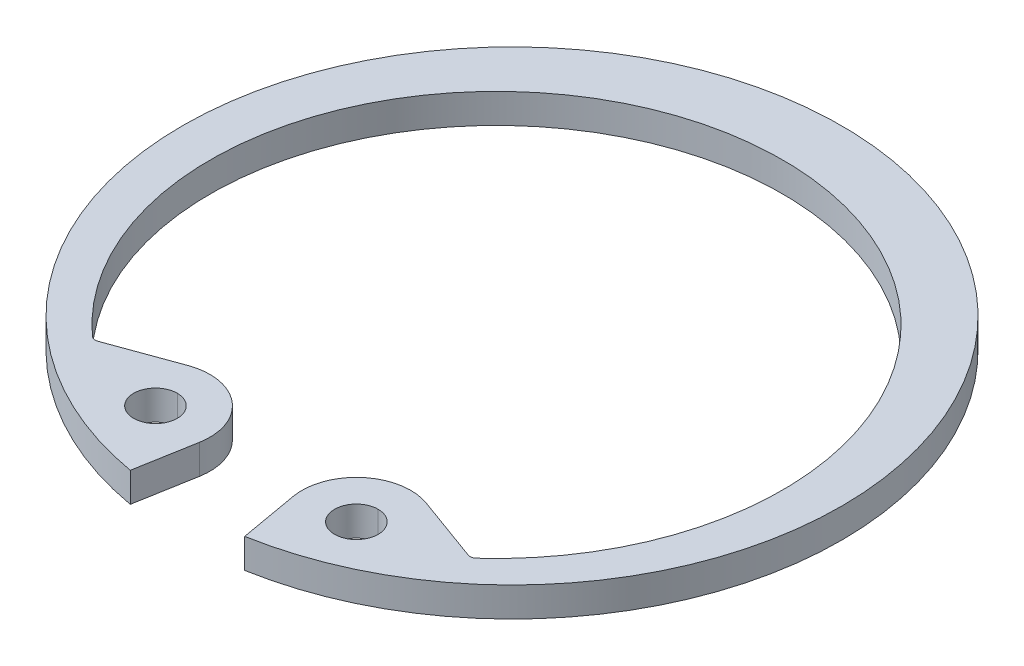
ISO-10303-21;
HEADER;
FILE_DESCRIPTION(('STEP AP214'),'2;1');
FILE_NAME('part.step','',(''),(''),'','','');
FILE_SCHEMA(('AUTOMOTIVE_DESIGN { 1 0 10303 214 1 1 1 1 }'));
ENDSEC;
DATA;
#1=APPLICATION_CONTEXT('core data for automotive mechanical design processes');
#2=APPLICATION_PROTOCOL_DEFINITION('international standard','automotive_design',2000,#1);
#3=PRODUCT_CONTEXT('',#1,'mechanical');
#4=PRODUCT('Part','Part','',(#3));
#5=PRODUCT_RELATED_PRODUCT_CATEGORY('part','',(#4));
#6=PRODUCT_DEFINITION_FORMATION('','',#4);
#7=PRODUCT_DEFINITION_CONTEXT('part definition',#1,'design');
#8=PRODUCT_DEFINITION('design','',#6,#7);
#9=PRODUCT_DEFINITION_SHAPE('','',#8);
#10=(LENGTH_UNIT() NAMED_UNIT(*) SI_UNIT(.MILLI.,.METRE.));
#11=(NAMED_UNIT(*) PLANE_ANGLE_UNIT() SI_UNIT($,.RADIAN.));
#12=(NAMED_UNIT(*) SI_UNIT($,.STERADIAN.) SOLID_ANGLE_UNIT());
#13=UNCERTAINTY_MEASURE_WITH_UNIT(LENGTH_MEASURE(1.E-05),#10,'distance_accuracy_value','');
#14=(GEOMETRIC_REPRESENTATION_CONTEXT(3) GLOBAL_UNCERTAINTY_ASSIGNED_CONTEXT((#13)) GLOBAL_UNIT_ASSIGNED_CONTEXT((#10,
#11,#12)) REPRESENTATION_CONTEXT('',''));
#15=CARTESIAN_POINT('',(0.,0.,0.));
#16=DIRECTION('',(0.,0.,1.));
#17=DIRECTION('',(1.,0.,0.));
#18=AXIS2_PLACEMENT_3D('',#15,#16,#17);
#19=CARTESIAN_POINT('',(6.77409763910835,-1.0668,8.03619111744191));
#20=DIRECTION('',(0.,1.,0.));
#21=DIRECTION('',(0.,0.,1.));
#22=AXIS2_PLACEMENT_3D('',#19,#20,#21);
#23=CYLINDRICAL_SURFACE('',#22,0.254);
#24=DIRECTION('',(0.,1.,0.));
#25=VECTOR('',#24,1.);
#26=CARTESIAN_POINT('',(6.77409763910835,-1.0668,8.29019111744191));
#27=LINE('',#26,#25);
#28=CARTESIAN_POINT('',(6.77409763910835,-1.0668,8.29019111744191));
#29=VERTEX_POINT('',#28);
#30=CARTESIAN_POINT('',(6.77409763910835,0.,8.29019111744191));
#31=VERTEX_POINT('',#30);
#32=EDGE_CURVE('E311',#29,#31,#27,.T.);
#33=ORIENTED_EDGE('',*,*,#32,.F.);
#34=CARTESIAN_POINT('',(6.77409763910835,-1.0668,8.03619111744191));
#35=DIRECTION('',(0.,1.,0.));
#36=DIRECTION('',(0.,0.,-1.));
#37=AXIS2_PLACEMENT_3D('',#34,#35,#36);
#38=CIRCLE('',#37,0.254);
#39=CARTESIAN_POINT('',(6.68722452270362,-1.0668,8.27487304312153));
#40=VERTEX_POINT('',#39);
#41=EDGE_CURVE('E282',#40,#29,#38,.T.);
#42=ORIENTED_EDGE('',*,*,#41,.F.);
#43=DIRECTION('',(0.,-1.,0.));
#44=VECTOR('',#43,1.);
#45=CARTESIAN_POINT('',(6.68722452270362,-1.0668,8.27487304312153));
#46=LINE('',#45,#44);
#47=CARTESIAN_POINT('',(6.68722452270362,0.,8.27487304312153));
#48=VERTEX_POINT('',#47);
#49=EDGE_CURVE('E265',#48,#40,#46,.T.);
#50=ORIENTED_EDGE('',*,*,#49,.F.);
#51=CARTESIAN_POINT('',(6.77409763910835,0.,8.03619111744191));
#52=DIRECTION('',(0.,-1.,0.));
#53=DIRECTION('',(0.,0.,-1.));
#54=AXIS2_PLACEMENT_3D('',#51,#52,#53);
#55=CIRCLE('',#54,0.254);
#56=EDGE_CURVE('E161',#31,#48,#55,.T.);
#57=ORIENTED_EDGE('',*,*,#56,.F.);
#58=EDGE_LOOP('',(#33,#42,#50,#57));
#59=FACE_BOUND('',#58,.T.);
#60=ADVANCED_FACE('F18',(#59),#23,.F.);
#61=CARTESIAN_POINT('',(-6.77409763910834,-1.0668,8.03619111744189));
#62=DIRECTION('',(0.,1.,0.));
#63=DIRECTION('',(0.,0.,1.));
#64=AXIS2_PLACEMENT_3D('',#61,#62,#63);
#65=CYLINDRICAL_SURFACE('',#64,0.254);
#66=DIRECTION('',(0.,1.,0.));
#67=VECTOR('',#66,1.);
#68=CARTESIAN_POINT('',(-6.77409763910834,-1.0668,8.29019111744189));
#69=LINE('',#68,#67);
#70=CARTESIAN_POINT('',(-6.77409763910834,-1.0668,8.29019111744189));
#71=VERTEX_POINT('',#70);
#72=CARTESIAN_POINT('',(-6.77409763910834,0.,8.29019111744189));
#73=VERTEX_POINT('',#72);
#74=EDGE_CURVE('E312',#71,#73,#69,.T.);
#75=ORIENTED_EDGE('',*,*,#74,.F.);
#76=CARTESIAN_POINT('',(-6.77409763910834,-1.0668,8.03619111744189));
#77=DIRECTION('',(0.,1.,0.));
#78=DIRECTION('',(0.,0.,-1.));
#79=AXIS2_PLACEMENT_3D('',#76,#77,#78);
#80=CIRCLE('',#79,0.254);
#81=CARTESIAN_POINT('',(-6.94467358958401,-1.0668,8.22439272508465));
#82=VERTEX_POINT('',#81);
#83=EDGE_CURVE('E253',#82,#71,#80,.T.);
#84=ORIENTED_EDGE('',*,*,#83,.F.);
#85=DIRECTION('',(0.,-1.,0.));
#86=VECTOR('',#85,1.);
#87=CARTESIAN_POINT('',(-6.94467358958402,-1.0668,8.22439272508465));
#88=LINE('',#87,#86);
#89=CARTESIAN_POINT('',(-6.94467358958401,0.,8.22439272508465));
#90=VERTEX_POINT('',#89);
#91=EDGE_CURVE('E214',#90,#82,#88,.T.);
#92=ORIENTED_EDGE('',*,*,#91,.F.);
#93=CARTESIAN_POINT('',(-6.77409763910834,0.,8.03619111744189));
#94=DIRECTION('',(0.,-1.,0.));
#95=DIRECTION('',(0.,0.,-1.));
#96=AXIS2_PLACEMENT_3D('',#93,#94,#95);
#97=CIRCLE('',#96,0.254);
#98=EDGE_CURVE('E258',#73,#90,#97,.T.);
#99=ORIENTED_EDGE('',*,*,#98,.F.);
#100=EDGE_LOOP('',(#75,#84,#92,#99));
#101=FACE_BOUND('',#100,.T.);
#102=ADVANCED_FACE('F372',(#101),#65,.F.);
#103=CARTESIAN_POINT('',(-3.63119739594349,-1.0668,9.2574040789896));
#104=DIRECTION('',(0.,1.,0.));
#105=DIRECTION('',(0.,0.,1.));
#106=AXIS2_PLACEMENT_3D('',#103,#104,#105);
#107=CYLINDRICAL_SURFACE('',#106,0.7874);
#108=DIRECTION('',(0.,1.,0.));
#109=VECTOR('',#108,1.);
#110=CARTESIAN_POINT('',(-3.63119739594349,-1.0668,8.4700040789896));
#111=LINE('',#110,#109);
#112=CARTESIAN_POINT('',(-3.63119739594349,-1.0668,8.4700040789896));
#113=VERTEX_POINT('',#112);
#114=CARTESIAN_POINT('',(-3.63119739594349,0.,8.4700040789896));
#115=VERTEX_POINT('',#114);
#116=EDGE_CURVE('E289',#113,#115,#111,.T.);
#117=ORIENTED_EDGE('',*,*,#116,.F.);
#118=CARTESIAN_POINT('',(-3.63119739594349,-1.0668,9.2574040789896));
#119=DIRECTION('',(0.,1.,0.));
#120=DIRECTION('',(0.,0.,1.));
#121=AXIS2_PLACEMENT_3D('',#118,#119,#120);
#122=CIRCLE('',#121,0.7874);
#123=CARTESIAN_POINT('',(-3.63119739594349,-1.0668,10.0448040789896));
#124=VERTEX_POINT('',#123);
#125=EDGE_CURVE('E249',#124,#113,#122,.T.);
#126=ORIENTED_EDGE('',*,*,#125,.F.);
#127=DIRECTION('',(0.,1.,0.));
#128=VECTOR('',#127,1.);
#129=CARTESIAN_POINT('',(-3.63119739594349,-1.0668,10.0448040789896));
#130=LINE('',#129,#128);
#131=CARTESIAN_POINT('',(-3.63119739594349,0.,10.0448040789896));
#132=VERTEX_POINT('',#131);
#133=EDGE_CURVE('E209',#124,#132,#130,.T.);
#134=ORIENTED_EDGE('',*,*,#133,.T.);
#135=CARTESIAN_POINT('',(-3.63119739594349,0.,9.2574040789896));
#136=DIRECTION('',(0.,1.,0.));
#137=DIRECTION('',(0.,0.,1.));
#138=AXIS2_PLACEMENT_3D('',#135,#136,#137);
#139=CIRCLE('',#138,0.7874);
#140=EDGE_CURVE('E29',#132,#115,#139,.T.);
#141=ORIENTED_EDGE('',*,*,#140,.T.);
#142=EDGE_LOOP('',(#117,#126,#134,#141));
#143=FACE_BOUND('',#142,.T.);
#144=ADVANCED_FACE('F417',(#143),#107,.F.);
#145=CARTESIAN_POINT('',(3.63119739594349,-1.0668,9.25740407898959));
#146=DIRECTION('',(0.,1.,0.));
#147=DIRECTION('',(0.,0.,1.));
#148=AXIS2_PLACEMENT_3D('',#145,#146,#147);
#149=CYLINDRICAL_SURFACE('',#148,0.7874);
#150=DIRECTION('',(0.,1.,0.));
#151=VECTOR('',#150,1.);
#152=CARTESIAN_POINT('',(3.63119739594349,-1.0668,8.4700040789896));
#153=LINE('',#152,#151);
#154=CARTESIAN_POINT('',(3.63119739594349,-1.0668,8.4700040789896));
#155=VERTEX_POINT('',#154);
#156=CARTESIAN_POINT('',(3.63119739594349,0.,8.4700040789896));
#157=VERTEX_POINT('',#156);
#158=EDGE_CURVE('E189',#155,#157,#153,.T.);
#159=ORIENTED_EDGE('',*,*,#158,.F.);
#160=CARTESIAN_POINT('',(3.63119739594349,-1.0668,9.25740407898959));
#161=DIRECTION('',(0.,1.,0.));
#162=DIRECTION('',(0.,0.,1.));
#163=AXIS2_PLACEMENT_3D('',#160,#161,#162);
#164=CIRCLE('',#163,0.7874);
#165=CARTESIAN_POINT('',(3.63119739594349,-1.0668,10.0448040789896));
#166=VERTEX_POINT('',#165);
#167=EDGE_CURVE('E252',#166,#155,#164,.T.);
#168=ORIENTED_EDGE('',*,*,#167,.F.);
#169=DIRECTION('',(0.,1.,0.));
#170=VECTOR('',#169,1.);
#171=CARTESIAN_POINT('',(3.63119739594349,-1.0668,10.0448040789896));
#172=LINE('',#171,#170);
#173=CARTESIAN_POINT('',(3.63119739594349,0.,10.0448040789896));
#174=VERTEX_POINT('',#173);
#175=EDGE_CURVE('E192',#166,#174,#172,.T.);
#176=ORIENTED_EDGE('',*,*,#175,.T.);
#177=CARTESIAN_POINT('',(3.63119739594349,0.,9.25740407898959));
#178=DIRECTION('',(0.,1.,0.));
#179=DIRECTION('',(0.,0.,1.));
#180=AXIS2_PLACEMENT_3D('',#177,#178,#179);
#181=CIRCLE('',#180,0.7874);
#182=EDGE_CURVE('E11',#174,#157,#181,.T.);
#183=ORIENTED_EDGE('',*,*,#182,.T.);
#184=EDGE_LOOP('',(#159,#168,#176,#183));
#185=FACE_BOUND('',#184,.T.);
#186=ADVANCED_FACE('F187',(#185),#149,.F.);
#187=CARTESIAN_POINT('',(3.63119739594349,0.,9.2574040789896));
#188=DIRECTION('',(0.,-1.,0.));
#189=DIRECTION('',(0.,0.,-1.));
#190=AXIS2_PLACEMENT_3D('',#187,#188,#189);
#191=PLANE('',#190);
#192=ORIENTED_EDGE('',*,*,#182,.F.);
#193=CARTESIAN_POINT('',(3.63119739594349,0.,9.25740407898959));
#194=DIRECTION('',(0.,1.,0.));
#195=DIRECTION('',(0.,0.,1.));
#196=AXIS2_PLACEMENT_3D('',#193,#194,#195);
#197=CIRCLE('',#196,0.7874);
#198=EDGE_CURVE('E194',#157,#174,#197,.T.);
#199=ORIENTED_EDGE('',*,*,#198,.F.);
#200=EDGE_LOOP('',(#192,#199));
#201=FACE_BOUND('',#200,.T.);
#202=ORIENTED_EDGE('',*,*,#140,.F.);
#203=CARTESIAN_POINT('',(-3.63119739594349,0.,9.2574040789896));
#204=DIRECTION('',(0.,1.,0.));
#205=DIRECTION('',(0.,0.,1.));
#206=AXIS2_PLACEMENT_3D('',#203,#204,#205);
#207=CIRCLE('',#206,0.7874);
#208=EDGE_CURVE('E22',#115,#132,#207,.T.);
#209=ORIENTED_EDGE('',*,*,#208,.F.);
#210=EDGE_LOOP('',(#202,#209));
#211=FACE_BOUND('',#210,.T.);
#212=CARTESIAN_POINT('',(3.63119739594349,0.,9.2574040789896));
#213=DIRECTION('',(0.,1.,0.));
#214=DIRECTION('',(0.,0.,-1.));
#215=AXIS2_PLACEMENT_3D('',#212,#213,#214);
#216=CIRCLE('',#215,1.9685);
#217=CARTESIAN_POINT('',(4.30446404808007,0.,7.40761915497254));
#218=VERTEX_POINT('',#217);
#219=CARTESIAN_POINT('',(1.69260333413896,0.,9.59923051672694));
#220=VERTEX_POINT('',#219);
#221=EDGE_CURVE('E244',#218,#220,#216,.T.);
#222=ORIENTED_EDGE('',*,*,#221,.T.);
#223=DIRECTION('',(0.173648177666924,0.,0.984807753012209));
#224=VECTOR('',#223,1.);
#225=CARTESIAN_POINT('',(2.06860128127499,0.,11.7316208385332));
#226=LINE('',#225,#224);
#227=CARTESIAN_POINT('',(2.06860128127499,0.,11.7316208385332));
#228=VERTEX_POINT('',#227);
#229=EDGE_CURVE('E245',#220,#228,#226,.T.);
#230=ORIENTED_EDGE('',*,*,#229,.T.);
#231=CARTESIAN_POINT('',(0.,0.,0.));
#232=DIRECTION('',(0.,1.,0.));
#233=DIRECTION('',(0.,0.,1.));
#234=AXIS2_PLACEMENT_3D('',#231,#232,#233);
#235=CIRCLE('',#234,11.9126);
#236=CARTESIAN_POINT('',(-2.068601281275,0.,11.7316208385332));
#237=VERTEX_POINT('',#236);
#238=EDGE_CURVE('E269',#228,#237,#235,.T.);
#239=ORIENTED_EDGE('',*,*,#238,.T.);
#240=DIRECTION('',(0.173648177666924,0.,-0.984807753012209));
#241=VECTOR('',#240,1.);
#242=CARTESIAN_POINT('',(-2.06860128127499,0.,11.7316208385332));
#243=LINE('',#242,#241);
#244=CARTESIAN_POINT('',(-1.69260333413896,0.,9.59923051672694));
#245=VERTEX_POINT('',#244);
#246=EDGE_CURVE('E237',#237,#245,#243,.T.);
#247=ORIENTED_EDGE('',*,*,#246,.T.);
#248=CARTESIAN_POINT('',(-3.63119739594349,0.,9.2574040789896));
#249=DIRECTION('',(0.,1.,0.));
#250=DIRECTION('',(0.,0.,1.));
#251=AXIS2_PLACEMENT_3D('',#248,#249,#250);
#252=CIRCLE('',#251,1.9685);
#253=CARTESIAN_POINT('',(-4.30446404808006,0.,7.40761915497254));
#254=VERTEX_POINT('',#253);
#255=EDGE_CURVE('E233',#245,#254,#252,.T.);
#256=ORIENTED_EDGE('',*,*,#255,.T.);
#257=DIRECTION('',(-0.93969262078591,0.,0.342020143325665));
#258=VECTOR('',#257,1.);
#259=CARTESIAN_POINT('',(-6.82995615480247,0.,8.32682310869373));
#260=LINE('',#259,#258);
#261=CARTESIAN_POINT('',(-6.68722452270362,0.,8.27487304312151));
#262=VERTEX_POINT('',#261);
#263=EDGE_CURVE('E218',#254,#262,#260,.T.);
#264=ORIENTED_EDGE('',*,*,#263,.T.);
#265=CARTESIAN_POINT('',(-6.77409763910834,0.,8.03619111744189));
#266=DIRECTION('',(0.,-1.,0.));
#267=DIRECTION('',(0.,0.,-1.));
#268=AXIS2_PLACEMENT_3D('',#265,#266,#267);
#269=CIRCLE('',#268,0.254);
#270=EDGE_CURVE('E316',#262,#73,#269,.T.);
#271=ORIENTED_EDGE('',*,*,#270,.T.);
#272=ORIENTED_EDGE('',*,*,#98,.T.);
#273=CARTESIAN_POINT('',(0.,0.,0.562124213790268));
#274=DIRECTION('',(0.,-1.,0.));
#275=DIRECTION('',(0.,0.,1.));
#276=AXIS2_PLACEMENT_3D('',#273,#274,#275);
#277=CIRCLE('',#276,10.3411242137903);
#278=CARTESIAN_POINT('',(6.94467358958403,0.,8.22439272508467));
#279=VERTEX_POINT('',#278);
#280=EDGE_CURVE('E256',#90,#279,#277,.T.);
#281=ORIENTED_EDGE('',*,*,#280,.T.);
#282=CARTESIAN_POINT('',(6.77409763910835,0.,8.03619111744191));
#283=DIRECTION('',(0.,-1.,0.));
#284=DIRECTION('',(0.,0.,-1.));
#285=AXIS2_PLACEMENT_3D('',#282,#283,#284);
#286=CIRCLE('',#285,0.254);
#287=EDGE_CURVE('E277',#279,#31,#286,.T.);
#288=ORIENTED_EDGE('',*,*,#287,.T.);
#289=ORIENTED_EDGE('',*,*,#56,.T.);
#290=DIRECTION('',(-0.939692620785907,0.,-0.342020143325672));
#291=VECTOR('',#290,1.);
#292=CARTESIAN_POINT('',(6.82995615480248,0.,8.32682310869375));
#293=LINE('',#292,#291);
#294=EDGE_CURVE('E297',#48,#218,#293,.T.);
#295=ORIENTED_EDGE('',*,*,#294,.T.);
#296=EDGE_LOOP('',(#222,#230,#239,#247,#256,#264,#271,#272,#281,#288,#289,#295));
#297=FACE_BOUND('',#296,.T.);
#298=ADVANCED_FACE('F195',(#201,#211,#297),#191,.F.);
#299=CARTESIAN_POINT('',(3.63119739594349,-1.0668,9.2574040789896));
#300=DIRECTION('',(0.,-1.,0.));
#301=DIRECTION('',(0.,0.,-1.));
#302=AXIS2_PLACEMENT_3D('',#299,#300,#301);
#303=PLANE('',#302);
#304=ORIENTED_EDGE('',*,*,#167,.T.);
#305=CARTESIAN_POINT('',(3.63119739594349,-1.0668,9.25740407898959));
#306=DIRECTION('',(0.,1.,0.));
#307=DIRECTION('',(0.,0.,1.));
#308=AXIS2_PLACEMENT_3D('',#305,#306,#307);
#309=CIRCLE('',#308,0.7874);
#310=EDGE_CURVE('E202',#155,#166,#309,.T.);
#311=ORIENTED_EDGE('',*,*,#310,.T.);
#312=EDGE_LOOP('',(#304,#311));
#313=FACE_BOUND('',#312,.T.);
#314=ORIENTED_EDGE('',*,*,#125,.T.);
#315=CARTESIAN_POINT('',(-3.63119739594349,-1.0668,9.2574040789896));
#316=DIRECTION('',(0.,1.,0.));
#317=DIRECTION('',(0.,0.,1.));
#318=AXIS2_PLACEMENT_3D('',#315,#316,#317);
#319=CIRCLE('',#318,0.7874);
#320=EDGE_CURVE('E286',#113,#124,#319,.T.);
#321=ORIENTED_EDGE('',*,*,#320,.T.);
#322=EDGE_LOOP('',(#314,#321));
#323=FACE_BOUND('',#322,.T.);
#324=CARTESIAN_POINT('',(3.63119739594349,-1.0668,9.2574040789896));
#325=DIRECTION('',(0.,1.,0.));
#326=DIRECTION('',(0.,0.,-1.));
#327=AXIS2_PLACEMENT_3D('',#324,#325,#326);
#328=CIRCLE('',#327,1.9685);
#329=CARTESIAN_POINT('',(4.30446404808007,-1.0668,7.40761915497254));
#330=VERTEX_POINT('',#329);
#331=CARTESIAN_POINT('',(1.69260333413896,-1.0668,9.59923051672694));
#332=VERTEX_POINT('',#331);
#333=EDGE_CURVE('E219',#330,#332,#328,.T.);
#334=ORIENTED_EDGE('',*,*,#333,.F.);
#335=DIRECTION('',(-0.939692620785907,0.,-0.342020143325672));
#336=VECTOR('',#335,1.);
#337=CARTESIAN_POINT('',(6.82995615480248,-1.0668,8.32682310869375));
#338=LINE('',#337,#336);
#339=EDGE_CURVE('E262',#40,#330,#338,.T.);
#340=ORIENTED_EDGE('',*,*,#339,.F.);
#341=ORIENTED_EDGE('',*,*,#41,.T.);
#342=CARTESIAN_POINT('',(6.77409763910835,-1.0668,8.03619111744191));
#343=DIRECTION('',(0.,1.,0.));
#344=DIRECTION('',(0.,0.,-1.));
#345=AXIS2_PLACEMENT_3D('',#342,#343,#344);
#346=CIRCLE('',#345,0.254);
#347=CARTESIAN_POINT('',(6.94467358958403,-1.0668,8.22439272508467));
#348=VERTEX_POINT('',#347);
#349=EDGE_CURVE('E317',#29,#348,#346,.T.);
#350=ORIENTED_EDGE('',*,*,#349,.T.);
#351=CARTESIAN_POINT('',(0.,-1.0668,0.562124213790268));
#352=DIRECTION('',(0.,-1.,0.));
#353=DIRECTION('',(0.,0.,1.));
#354=AXIS2_PLACEMENT_3D('',#351,#352,#353);
#355=CIRCLE('',#354,10.3411242137903);
#356=EDGE_CURVE('E172',#82,#348,#355,.T.);
#357=ORIENTED_EDGE('',*,*,#356,.F.);
#358=ORIENTED_EDGE('',*,*,#83,.T.);
#359=CARTESIAN_POINT('',(-6.77409763910834,-1.0668,8.03619111744189));
#360=DIRECTION('',(0.,1.,0.));
#361=DIRECTION('',(0.,0.,-1.));
#362=AXIS2_PLACEMENT_3D('',#359,#360,#361);
#363=CIRCLE('',#362,0.254);
#364=CARTESIAN_POINT('',(-6.68722452270362,-1.0668,8.27487304312151));
#365=VERTEX_POINT('',#364);
#366=EDGE_CURVE('E276',#71,#365,#363,.T.);
#367=ORIENTED_EDGE('',*,*,#366,.T.);
#368=DIRECTION('',(-0.93969262078591,0.,0.342020143325665));
#369=VECTOR('',#368,1.);
#370=CARTESIAN_POINT('',(-6.82995615480247,-1.0668,8.32682310869373));
#371=LINE('',#370,#369);
#372=CARTESIAN_POINT('',(-4.30446404808006,-1.0668,7.40761915497254));
#373=VERTEX_POINT('',#372);
#374=EDGE_CURVE('E213',#373,#365,#371,.T.);
#375=ORIENTED_EDGE('',*,*,#374,.F.);
#376=CARTESIAN_POINT('',(-3.63119739594349,-1.0668,9.2574040789896));
#377=DIRECTION('',(0.,1.,0.));
#378=DIRECTION('',(0.,0.,1.));
#379=AXIS2_PLACEMENT_3D('',#376,#377,#378);
#380=CIRCLE('',#379,1.9685);
#381=CARTESIAN_POINT('',(-1.69260333413896,-1.0668,9.59923051672694));
#382=VERTEX_POINT('',#381);
#383=EDGE_CURVE('E232',#382,#373,#380,.T.);
#384=ORIENTED_EDGE('',*,*,#383,.F.);
#385=DIRECTION('',(0.173648177666924,0.,-0.984807753012209));
#386=VECTOR('',#385,1.);
#387=CARTESIAN_POINT('',(-2.06860128127499,-1.0668,11.7316208385332));
#388=LINE('',#387,#386);
#389=CARTESIAN_POINT('',(-2.068601281275,-1.0668,11.7316208385332));
#390=VERTEX_POINT('',#389);
#391=EDGE_CURVE('E266',#390,#382,#388,.T.);
#392=ORIENTED_EDGE('',*,*,#391,.F.);
#393=CARTESIAN_POINT('',(0.,-1.0668,0.));
#394=DIRECTION('',(0.,1.,0.));
#395=DIRECTION('',(0.,0.,1.));
#396=AXIS2_PLACEMENT_3D('',#393,#394,#395);
#397=CIRCLE('',#396,11.9126);
#398=CARTESIAN_POINT('',(2.06860128127499,-1.0668,11.7316208385332));
#399=VERTEX_POINT('',#398);
#400=EDGE_CURVE('E248',#399,#390,#397,.T.);
#401=ORIENTED_EDGE('',*,*,#400,.F.);
#402=DIRECTION('',(0.173648177666924,0.,0.984807753012209));
#403=VECTOR('',#402,1.);
#404=CARTESIAN_POINT('',(2.06860128127499,-1.0668,11.7316208385332));
#405=LINE('',#404,#403);
#406=EDGE_CURVE('E44',#332,#399,#405,.T.);
#407=ORIENTED_EDGE('',*,*,#406,.F.);
#408=EDGE_LOOP('',(#334,#340,#341,#350,#357,#358,#367,#375,#384,#392,#401,#407));
#409=FACE_BOUND('',#408,.T.);
#410=ADVANCED_FACE('F361',(#313,#323,#409),#303,.T.);
#411=CARTESIAN_POINT('',(2.06860128127499,-1.0668,11.7316208385332));
#412=DIRECTION('',(-0.984807753012209,0.,0.173648177666924));
#413=DIRECTION('',(0.,1.,0.));
#414=AXIS2_PLACEMENT_3D('',#411,#412,#413);
#415=PLANE('',#414);
#416=ORIENTED_EDGE('',*,*,#229,.F.);
#417=DIRECTION('',(0.,1.,0.));
#418=VECTOR('',#417,1.);
#419=CARTESIAN_POINT('',(1.69260333413896,-1.0668,9.59923051672694));
#420=LINE('',#419,#418);
#421=EDGE_CURVE('E223',#332,#220,#420,.T.);
#422=ORIENTED_EDGE('',*,*,#421,.F.);
#423=ORIENTED_EDGE('',*,*,#406,.T.);
#424=DIRECTION('',(0.,1.,0.));
#425=VECTOR('',#424,1.);
#426=CARTESIAN_POINT('',(2.06860128127499,-1.0668,11.7316208385332));
#427=LINE('',#426,#425);
#428=EDGE_CURVE('E272',#399,#228,#427,.T.);
#429=ORIENTED_EDGE('',*,*,#428,.T.);
#430=EDGE_LOOP('',(#416,#422,#423,#429));
#431=FACE_BOUND('',#430,.T.);
#432=ADVANCED_FACE('F20',(#431),#415,.T.);
#433=CARTESIAN_POINT('',(0.,-1.0668,0.));
#434=DIRECTION('',(0.,1.,0.));
#435=DIRECTION('',(0.,0.,1.));
#436=AXIS2_PLACEMENT_3D('',#433,#434,#435);
#437=CYLINDRICAL_SURFACE('',#436,11.9126);
#438=ORIENTED_EDGE('',*,*,#238,.F.);
#439=ORIENTED_EDGE('',*,*,#428,.F.);
#440=ORIENTED_EDGE('',*,*,#400,.T.);
#441=DIRECTION('',(0.,1.,0.));
#442=VECTOR('',#441,1.);
#443=CARTESIAN_POINT('',(-2.068601281275,-1.0668,11.7316208385332));
#444=LINE('',#443,#442);
#445=EDGE_CURVE('E240',#390,#237,#444,.T.);
#446=ORIENTED_EDGE('',*,*,#445,.T.);
#447=EDGE_LOOP('',(#438,#439,#440,#446));
#448=FACE_BOUND('',#447,.T.);
#449=ADVANCED_FACE('F398',(#448),#437,.T.);
#450=CARTESIAN_POINT('',(-2.06860128127499,-1.0668,11.7316208385332));
#451=DIRECTION('',(0.984807753012209,0.,0.173648177666924));
#452=DIRECTION('',(0.,-1.,0.));
#453=AXIS2_PLACEMENT_3D('',#450,#451,#452);
#454=PLANE('',#453);
#455=ORIENTED_EDGE('',*,*,#246,.F.);
#456=ORIENTED_EDGE('',*,*,#445,.F.);
#457=ORIENTED_EDGE('',*,*,#391,.T.);
#458=DIRECTION('',(0.,1.,0.));
#459=VECTOR('',#458,1.);
#460=CARTESIAN_POINT('',(-1.69260333413896,-1.0668,9.59923051672694));
#461=LINE('',#460,#459);
#462=EDGE_CURVE('E228',#382,#245,#461,.T.);
#463=ORIENTED_EDGE('',*,*,#462,.T.);
#464=EDGE_LOOP('',(#455,#456,#457,#463));
#465=FACE_BOUND('',#464,.T.);
#466=ADVANCED_FACE('F395',(#465),#454,.T.);
#467=CARTESIAN_POINT('',(-3.63119739594349,-1.0668,9.2574040789896));
#468=DIRECTION('',(0.,1.,0.));
#469=DIRECTION('',(0.,0.,1.));
#470=AXIS2_PLACEMENT_3D('',#467,#468,#469);
#471=CYLINDRICAL_SURFACE('',#470,1.9685);
#472=ORIENTED_EDGE('',*,*,#255,.F.);
#473=ORIENTED_EDGE('',*,*,#462,.F.);
#474=ORIENTED_EDGE('',*,*,#383,.T.);
#475=DIRECTION('',(0.,1.,0.));
#476=VECTOR('',#475,1.);
#477=CARTESIAN_POINT('',(-4.30446404808006,-1.0668,7.40761915497254));
#478=LINE('',#477,#476);
#479=EDGE_CURVE('E227',#373,#254,#478,.T.);
#480=ORIENTED_EDGE('',*,*,#479,.T.);
#481=EDGE_LOOP('',(#472,#473,#474,#480));
#482=FACE_BOUND('',#481,.T.);
#483=ADVANCED_FACE('F388',(#482),#471,.T.);
#484=CARTESIAN_POINT('',(-6.82995615480247,-1.0668,8.32682310869373));
#485=DIRECTION('',(-0.342020143325665,0.,-0.93969262078591));
#486=DIRECTION('',(-0.93969262078591,0.,0.342020143325665));
#487=AXIS2_PLACEMENT_3D('',#484,#485,#486);
#488=PLANE('',#487);
#489=ORIENTED_EDGE('',*,*,#374,.T.);
#490=DIRECTION('',(0.,1.,0.));
#491=VECTOR('',#490,1.);
#492=CARTESIAN_POINT('',(-6.68722452270362,0.,8.27487304312151));
#493=LINE('',#492,#491);
#494=EDGE_CURVE('E290',#365,#262,#493,.T.);
#495=ORIENTED_EDGE('',*,*,#494,.T.);
#496=ORIENTED_EDGE('',*,*,#263,.F.);
#497=ORIENTED_EDGE('',*,*,#479,.F.);
#498=EDGE_LOOP('',(#489,#495,#496,#497));
#499=FACE_BOUND('',#498,.T.);
#500=ADVANCED_FACE('F384',(#499),#488,.T.);
#501=CARTESIAN_POINT('',(0.,-1.0668,0.562124213790268));
#502=DIRECTION('',(0.,1.,0.));
#503=DIRECTION('',(0.,0.,1.));
#504=AXIS2_PLACEMENT_3D('',#501,#502,#503);
#505=CYLINDRICAL_SURFACE('',#504,10.3411242137903);
#506=ORIENTED_EDGE('',*,*,#280,.F.);
#507=ORIENTED_EDGE('',*,*,#91,.T.);
#508=ORIENTED_EDGE('',*,*,#356,.T.);
#509=DIRECTION('',(0.,1.,0.));
#510=VECTOR('',#509,1.);
#511=CARTESIAN_POINT('',(6.94467358958403,-1.0668,8.22439272508467));
#512=LINE('',#511,#510);
#513=EDGE_CURVE('E273',#348,#279,#512,.T.);
#514=ORIENTED_EDGE('',*,*,#513,.T.);
#515=EDGE_LOOP('',(#506,#507,#508,#514));
#516=FACE_BOUND('',#515,.T.);
#517=ADVANCED_FACE('F369',(#516),#505,.F.);
#518=CARTESIAN_POINT('',(6.82995615480248,-1.0668,8.32682310869375));
#519=DIRECTION('',(0.342020143325673,0.,-0.939692620785907));
#520=DIRECTION('',(0.,-1.,0.));
#521=AXIS2_PLACEMENT_3D('',#518,#519,#520);
#522=PLANE('',#521);
#523=ORIENTED_EDGE('',*,*,#294,.F.);
#524=ORIENTED_EDGE('',*,*,#49,.T.);
#525=ORIENTED_EDGE('',*,*,#339,.T.);
#526=DIRECTION('',(0.,1.,0.));
#527=VECTOR('',#526,1.);
#528=CARTESIAN_POINT('',(4.30446404808007,-1.0668,7.40761915497254));
#529=LINE('',#528,#527);
#530=EDGE_CURVE('E224',#330,#218,#529,.T.);
#531=ORIENTED_EDGE('',*,*,#530,.T.);
#532=EDGE_LOOP('',(#523,#524,#525,#531));
#533=FACE_BOUND('',#532,.T.);
#534=ADVANCED_FACE('F364',(#533),#522,.T.);
#535=CARTESIAN_POINT('',(3.63119739594349,-1.0668,9.2574040789896));
#536=DIRECTION('',(0.,1.,0.));
#537=DIRECTION('',(0.,0.,1.));
#538=AXIS2_PLACEMENT_3D('',#535,#536,#537);
#539=CYLINDRICAL_SURFACE('',#538,1.9685);
#540=ORIENTED_EDGE('',*,*,#221,.F.);
#541=ORIENTED_EDGE('',*,*,#530,.F.);
#542=ORIENTED_EDGE('',*,*,#333,.T.);
#543=ORIENTED_EDGE('',*,*,#421,.T.);
#544=EDGE_LOOP('',(#540,#541,#542,#543));
#545=FACE_BOUND('',#544,.T.);
#546=ADVANCED_FACE('F400',(#545),#539,.T.);
#547=CARTESIAN_POINT('',(3.63119739594349,-1.0668,9.25740407898959));
#548=DIRECTION('',(0.,1.,0.));
#549=DIRECTION('',(0.,0.,1.));
#550=AXIS2_PLACEMENT_3D('',#547,#548,#549);
#551=CYLINDRICAL_SURFACE('',#550,0.7874);
#552=ORIENTED_EDGE('',*,*,#310,.F.);
#553=ORIENTED_EDGE('',*,*,#158,.T.);
#554=ORIENTED_EDGE('',*,*,#198,.T.);
#555=ORIENTED_EDGE('',*,*,#175,.F.);
#556=EDGE_LOOP('',(#552,#553,#554,#555));
#557=FACE_BOUND('',#556,.T.);
#558=ADVANCED_FACE('F200',(#557),#551,.F.);
#559=CARTESIAN_POINT('',(-3.63119739594349,-1.0668,9.2574040789896));
#560=DIRECTION('',(0.,1.,0.));
#561=DIRECTION('',(0.,0.,1.));
#562=AXIS2_PLACEMENT_3D('',#559,#560,#561);
#563=CYLINDRICAL_SURFACE('',#562,0.7874);
#564=ORIENTED_EDGE('',*,*,#320,.F.);
#565=ORIENTED_EDGE('',*,*,#116,.T.);
#566=ORIENTED_EDGE('',*,*,#208,.T.);
#567=ORIENTED_EDGE('',*,*,#133,.F.);
#568=EDGE_LOOP('',(#564,#565,#566,#567));
#569=FACE_BOUND('',#568,.T.);
#570=ADVANCED_FACE('F408',(#569),#563,.F.);
#571=CARTESIAN_POINT('',(-6.77409763910834,-1.0668,8.03619111744189));
#572=DIRECTION('',(0.,1.,0.));
#573=DIRECTION('',(0.,0.,1.));
#574=AXIS2_PLACEMENT_3D('',#571,#572,#573);
#575=CYLINDRICAL_SURFACE('',#574,0.254);
#576=ORIENTED_EDGE('',*,*,#366,.F.);
#577=ORIENTED_EDGE('',*,*,#74,.T.);
#578=ORIENTED_EDGE('',*,*,#270,.F.);
#579=ORIENTED_EDGE('',*,*,#494,.F.);
#580=EDGE_LOOP('',(#576,#577,#578,#579));
#581=FACE_BOUND('',#580,.T.);
#582=ADVANCED_FACE('F377',(#581),#575,.F.);
#583=CARTESIAN_POINT('',(6.77409763910835,-1.0668,8.03619111744191));
#584=DIRECTION('',(0.,1.,0.));
#585=DIRECTION('',(0.,0.,1.));
#586=AXIS2_PLACEMENT_3D('',#583,#584,#585);
#587=CYLINDRICAL_SURFACE('',#586,0.254);
#588=ORIENTED_EDGE('',*,*,#349,.F.);
#589=ORIENTED_EDGE('',*,*,#32,.T.);
#590=ORIENTED_EDGE('',*,*,#287,.F.);
#591=ORIENTED_EDGE('',*,*,#513,.F.);
#592=EDGE_LOOP('',(#588,#589,#590,#591));
#593=FACE_BOUND('',#592,.T.);
#594=ADVANCED_FACE('F356',(#593),#587,.F.);
#595=CLOSED_SHELL('',(#60,#102,#144,#186,#298,#410,#432,#449,#466,#483,#500,#517,#534,#546,#558,
#570,#582,#594));
#596=MANIFOLD_SOLID_BREP('B1',#595);
#597=ADVANCED_BREP_SHAPE_REPRESENTATION('',(#18,#596),#14);
#598=SHAPE_DEFINITION_REPRESENTATION(#9,#597);
ENDSEC;
END-ISO-10303-21;
